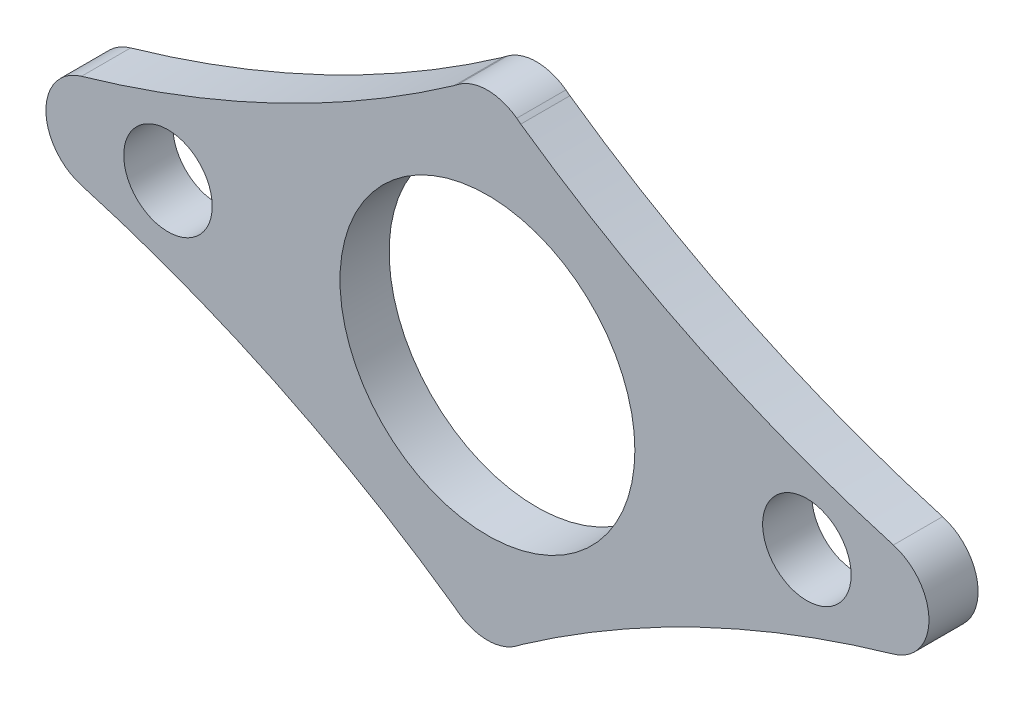
ISO-10303-21;
HEADER;
FILE_DESCRIPTION(('STEP AP214'),'2;1');
FILE_NAME('part.step','',(''),(''),'','','');
FILE_SCHEMA(('AUTOMOTIVE_DESIGN { 1 0 10303 214 1 1 1 1 }'));
ENDSEC;
DATA;
#1=APPLICATION_CONTEXT('core data for automotive mechanical design processes');
#2=APPLICATION_PROTOCOL_DEFINITION('international standard','automotive_design',2000,#1);
#3=PRODUCT_CONTEXT('',#1,'mechanical');
#4=PRODUCT('Part','Part','',(#3));
#5=PRODUCT_RELATED_PRODUCT_CATEGORY('part','',(#4));
#6=PRODUCT_DEFINITION_FORMATION('','',#4);
#7=PRODUCT_DEFINITION_CONTEXT('part definition',#1,'design');
#8=PRODUCT_DEFINITION('design','',#6,#7);
#9=PRODUCT_DEFINITION_SHAPE('','',#8);
#10=(LENGTH_UNIT() NAMED_UNIT(*) SI_UNIT(.MILLI.,.METRE.));
#11=(NAMED_UNIT(*) PLANE_ANGLE_UNIT() SI_UNIT($,.RADIAN.));
#12=(NAMED_UNIT(*) SI_UNIT($,.STERADIAN.) SOLID_ANGLE_UNIT());
#13=UNCERTAINTY_MEASURE_WITH_UNIT(LENGTH_MEASURE(1.E-05),#10,'distance_accuracy_value','');
#14=(GEOMETRIC_REPRESENTATION_CONTEXT(3) GLOBAL_UNCERTAINTY_ASSIGNED_CONTEXT((#13)) GLOBAL_UNIT_ASSIGNED_CONTEXT((#10,
#11,#12)) REPRESENTATION_CONTEXT('',''));
#15=CARTESIAN_POINT('',(0.,0.,0.));
#16=DIRECTION('',(0.,0.,1.));
#17=DIRECTION('',(1.,0.,0.));
#18=AXIS2_PLACEMENT_3D('',#15,#16,#17);
#19=CARTESIAN_POINT('',(-206.734819428964,-429.048910261727,10.));
#20=DIRECTION('',(0.,0.,-1.));
#21=DIRECTION('',(-1.,0.,0.));
#22=AXIS2_PLACEMENT_3D('',#19,#20,#21);
#23=PLANE('',#22);
#24=CARTESIAN_POINT('',(13.0163216309589,-20.9768778503982,10.));
#25=DIRECTION('',(0.,0.,1.));
#26=DIRECTION('',(1.,0.,0.));
#27=AXIS2_PLACEMENT_3D('',#24,#25,#26);
#28=CIRCLE('',#27,31.8082732651629);
#29=CARTESIAN_POINT('',(-6.78490273510037,-45.8702055049376,10.));
#30=VERTEX_POINT('',#29);
#31=CARTESIAN_POINT('',(-5.96852463865239,-46.4982778948805,10.));
#32=VERTEX_POINT('',#31);
#33=EDGE_CURVE('E135',#30,#32,#28,.T.);
#34=ORIENTED_EDGE('',*,*,#33,.T.);
#35=CARTESIAN_POINT('',(0.,-38.4747678376924,10.));
#36=DIRECTION('',(0.,0.,-1.));
#37=DIRECTION('',(-1.,0.,0.));
#38=AXIS2_PLACEMENT_3D('',#35,#36,#37);
#39=CIRCLE('',#38,10.);
#40=CARTESIAN_POINT('',(5.96852463865239,-46.4982778948805,10.));
#41=VERTEX_POINT('',#40);
#42=EDGE_CURVE('E214',#32,#41,#39,.F.);
#43=ORIENTED_EDGE('',*,*,#42,.T.);
#44=CARTESIAN_POINT('',(-13.0163216309589,-20.9768778503982,10.));
#45=DIRECTION('',(0.,0.,1.));
#46=DIRECTION('',(-1.,0.,0.));
#47=AXIS2_PLACEMENT_3D('',#44,#45,#46);
#48=CIRCLE('',#47,31.8082732651629);
#49=CARTESIAN_POINT('',(6.78490273510032,-45.8702055049375,10.));
#50=VERTEX_POINT('',#49);
#51=EDGE_CURVE('E158',#41,#50,#48,.T.);
#52=ORIENTED_EDGE('',*,*,#51,.T.);
#53=CARTESIAN_POINT('',(152.782580989368,-253.747413709875,10.));
#54=DIRECTION('',(0.,0.,-1.));
#55=DIRECTION('',(-1.,0.,0.));
#56=AXIS2_PLACEMENT_3D('',#53,#54,#55);
#57=CIRCLE('',#56,254.024124340023);
#58=CARTESIAN_POINT('',(82.6002961724135,-9.61076622616069,10.));
#59=VERTEX_POINT('',#58);
#60=EDGE_CURVE('E160',#50,#59,#57,.T.);
#61=ORIENTED_EDGE('',*,*,#60,.T.);
#62=CARTESIAN_POINT('',(79.8374764993098,0.,10.));
#63=DIRECTION('',(0.,0.,-1.));
#64=DIRECTION('',(-1.,0.,0.));
#65=AXIS2_PLACEMENT_3D('',#62,#63,#64);
#66=CIRCLE('',#65,10.);
#67=CARTESIAN_POINT('',(82.6002961724135,9.61076622616069,10.));
#68=VERTEX_POINT('',#67);
#69=EDGE_CURVE('E212',#59,#68,#66,.F.);
#70=ORIENTED_EDGE('',*,*,#69,.T.);
#71=CARTESIAN_POINT('',(152.782580989368,253.747413709875,10.));
#72=DIRECTION('',(0.,0.,-1.));
#73=DIRECTION('',(1.,0.,0.));
#74=AXIS2_PLACEMENT_3D('',#71,#72,#73);
#75=CIRCLE('',#74,254.024124340023);
#76=CARTESIAN_POINT('',(6.78490273510038,45.8702055049376,10.));
#77=VERTEX_POINT('',#76);
#78=EDGE_CURVE('E166',#68,#77,#75,.T.);
#79=ORIENTED_EDGE('',*,*,#78,.T.);
#80=CARTESIAN_POINT('',(-13.0163216309589,20.9768778503982,10.));
#81=DIRECTION('',(0.,0.,1.));
#82=DIRECTION('',(1.,0.,0.));
#83=AXIS2_PLACEMENT_3D('',#80,#81,#82);
#84=CIRCLE('',#83,31.8082732651629);
#85=CARTESIAN_POINT('',(5.96852463865239,46.4982778948805,10.));
#86=VERTEX_POINT('',#85);
#87=EDGE_CURVE('E168',#77,#86,#84,.T.);
#88=ORIENTED_EDGE('',*,*,#87,.T.);
#89=CARTESIAN_POINT('',(0.,38.4747678376924,10.));
#90=DIRECTION('',(0.,0.,-1.));
#91=DIRECTION('',(-1.,0.,0.));
#92=AXIS2_PLACEMENT_3D('',#89,#90,#91);
#93=CIRCLE('',#92,10.);
#94=CARTESIAN_POINT('',(-5.96852463865239,46.4982778948805,10.));
#95=VERTEX_POINT('',#94);
#96=EDGE_CURVE('E64',#86,#95,#93,.F.);
#97=ORIENTED_EDGE('',*,*,#96,.T.);
#98=CARTESIAN_POINT('',(13.0163216309589,20.9768778503982,10.));
#99=DIRECTION('',(0.,0.,1.));
#100=DIRECTION('',(-1.,0.,0.));
#101=AXIS2_PLACEMENT_3D('',#98,#99,#100);
#102=CIRCLE('',#101,31.8082732651629);
#103=CARTESIAN_POINT('',(-6.78490273510021,45.8702055049376,10.));
#104=VERTEX_POINT('',#103);
#105=EDGE_CURVE('E170',#95,#104,#102,.T.);
#106=ORIENTED_EDGE('',*,*,#105,.T.);
#107=CARTESIAN_POINT('',(-152.782580989368,253.747413709875,10.));
#108=DIRECTION('',(0.,0.,-1.));
#109=DIRECTION('',(-1.,0.,0.));
#110=AXIS2_PLACEMENT_3D('',#107,#108,#109);
#111=CIRCLE('',#110,254.024124340023);
#112=CARTESIAN_POINT('',(-82.6002961724134,9.61076622616072,10.));
#113=VERTEX_POINT('',#112);
#114=EDGE_CURVE('E172',#104,#113,#111,.T.);
#115=ORIENTED_EDGE('',*,*,#114,.T.);
#116=CARTESIAN_POINT('',(-79.8374764993097,0.,10.));
#117=DIRECTION('',(0.,0.,-1.));
#118=DIRECTION('',(-1.,0.,0.));
#119=AXIS2_PLACEMENT_3D('',#116,#117,#118);
#120=CIRCLE('',#119,10.);
#121=CARTESIAN_POINT('',(-82.6002961724134,-9.61076622616072,10.));
#122=VERTEX_POINT('',#121);
#123=EDGE_CURVE('E138',#113,#122,#120,.F.);
#124=ORIENTED_EDGE('',*,*,#123,.T.);
#125=CARTESIAN_POINT('',(-152.782580989368,-253.747413709875,10.));
#126=DIRECTION('',(0.,0.,-1.));
#127=DIRECTION('',(1.,0.,0.));
#128=AXIS2_PLACEMENT_3D('',#125,#126,#127);
#129=CIRCLE('',#128,254.024124340023);
#130=EDGE_CURVE('E131',#122,#30,#129,.T.);
#131=ORIENTED_EDGE('',*,*,#130,.T.);
#132=EDGE_LOOP('',(#34,#43,#52,#61,#70,#79,#88,#97,#106,#115,#124,#131));
#133=FACE_BOUND('',#132,.T.);
#134=CARTESIAN_POINT('',(0.,0.,10.));
#135=DIRECTION('',(0.,0.,1.));
#136=DIRECTION('',(1.,0.,0.));
#137=AXIS2_PLACEMENT_3D('',#134,#135,#136);
#138=CIRCLE('',#137,30.);
#139=CARTESIAN_POINT('',(30.,0.,10.));
#140=VERTEX_POINT('',#139);
#141=EDGE_CURVE('E177',#140,#140,#138,.T.);
#142=ORIENTED_EDGE('',*,*,#141,.F.);
#143=EDGE_LOOP('',(#142));
#144=FACE_BOUND('',#143,.T.);
#145=CARTESIAN_POINT('',(-65.,0.,10.));
#146=DIRECTION('',(0.,0.,1.));
#147=DIRECTION('',(1.,0.,0.));
#148=AXIS2_PLACEMENT_3D('',#145,#146,#147);
#149=CIRCLE('',#148,9.);
#150=CARTESIAN_POINT('',(-56.,0.,10.));
#151=VERTEX_POINT('',#150);
#152=EDGE_CURVE('E445',#151,#151,#149,.T.);
#153=ORIENTED_EDGE('',*,*,#152,.F.);
#154=EDGE_LOOP('',(#153));
#155=FACE_BOUND('',#154,.T.);
#156=CARTESIAN_POINT('',(65.,0.,10.));
#157=DIRECTION('',(0.,0.,1.));
#158=DIRECTION('',(1.,0.,0.));
#159=AXIS2_PLACEMENT_3D('',#156,#157,#158);
#160=CIRCLE('',#159,9.);
#161=CARTESIAN_POINT('',(74.,0.,10.));
#162=VERTEX_POINT('',#161);
#163=EDGE_CURVE('E452',#162,#162,#160,.T.);
#164=ORIENTED_EDGE('',*,*,#163,.F.);
#165=EDGE_LOOP('',(#164));
#166=FACE_BOUND('',#165,.T.);
#167=ADVANCED_FACE('F41',(#133,#144,#155,#166),#23,.F.);
#168=CARTESIAN_POINT('',(-206.734819428964,-429.048910261727,0.));
#169=DIRECTION('',(0.,0.,-1.));
#170=DIRECTION('',(-1.,0.,0.));
#171=AXIS2_PLACEMENT_3D('',#168,#169,#170);
#172=PLANE('',#171);
#173=CARTESIAN_POINT('',(-65.,0.,0.));
#174=DIRECTION('',(0.,0.,1.));
#175=DIRECTION('',(1.,0.,0.));
#176=AXIS2_PLACEMENT_3D('',#173,#174,#175);
#177=CIRCLE('',#176,9.);
#178=CARTESIAN_POINT('',(-56.,0.,0.));
#179=VERTEX_POINT('',#178);
#180=EDGE_CURVE('E448',#179,#179,#177,.T.);
#181=ORIENTED_EDGE('',*,*,#180,.T.);
#182=EDGE_LOOP('',(#181));
#183=FACE_BOUND('',#182,.T.);
#184=CARTESIAN_POINT('',(-13.0163216309589,-20.9768778503982,0.));
#185=DIRECTION('',(0.,0.,1.));
#186=DIRECTION('',(-1.,0.,0.));
#187=AXIS2_PLACEMENT_3D('',#184,#185,#186);
#188=CIRCLE('',#187,31.8082732651629);
#189=CARTESIAN_POINT('',(5.96852463865239,-46.4982778948805,0.));
#190=VERTEX_POINT('',#189);
#191=CARTESIAN_POINT('',(6.78490273510032,-45.8702055049375,0.));
#192=VERTEX_POINT('',#191);
#193=EDGE_CURVE('E179',#190,#192,#188,.T.);
#194=ORIENTED_EDGE('',*,*,#193,.F.);
#195=CARTESIAN_POINT('',(0.,-38.4747678376924,0.));
#196=DIRECTION('',(0.,0.,-1.));
#197=DIRECTION('',(-1.,0.,0.));
#198=AXIS2_PLACEMENT_3D('',#195,#196,#197);
#199=CIRCLE('',#198,10.);
#200=CARTESIAN_POINT('',(-5.96852463865239,-46.4982778948805,0.));
#201=VERTEX_POINT('',#200);
#202=EDGE_CURVE('E207',#190,#201,#199,.T.);
#203=ORIENTED_EDGE('',*,*,#202,.T.);
#204=CARTESIAN_POINT('',(13.0163216309589,-20.9768778503982,0.));
#205=DIRECTION('',(0.,0.,1.));
#206=DIRECTION('',(1.,0.,0.));
#207=AXIS2_PLACEMENT_3D('',#204,#205,#206);
#208=CIRCLE('',#207,31.8082732651629);
#209=CARTESIAN_POINT('',(-6.78490273510037,-45.8702055049376,0.));
#210=VERTEX_POINT('',#209);
#211=EDGE_CURVE('E176',#210,#201,#208,.T.);
#212=ORIENTED_EDGE('',*,*,#211,.F.);
#213=CARTESIAN_POINT('',(-152.782580989368,-253.747413709875,0.));
#214=DIRECTION('',(0.,0.,-1.));
#215=DIRECTION('',(1.,0.,0.));
#216=AXIS2_PLACEMENT_3D('',#213,#214,#215);
#217=CIRCLE('',#216,254.024124340023);
#218=CARTESIAN_POINT('',(-82.6002961724134,-9.61076622616072,0.));
#219=VERTEX_POINT('',#218);
#220=EDGE_CURVE('E148',#219,#210,#217,.T.);
#221=ORIENTED_EDGE('',*,*,#220,.F.);
#222=CARTESIAN_POINT('',(-79.8374764993097,0.,0.));
#223=DIRECTION('',(0.,0.,-1.));
#224=DIRECTION('',(-1.,0.,0.));
#225=AXIS2_PLACEMENT_3D('',#222,#223,#224);
#226=CIRCLE('',#225,10.);
#227=CARTESIAN_POINT('',(-82.6002961724134,9.61076622616072,0.));
#228=VERTEX_POINT('',#227);
#229=EDGE_CURVE('E203',#219,#228,#226,.T.);
#230=ORIENTED_EDGE('',*,*,#229,.T.);
#231=CARTESIAN_POINT('',(-152.782580989368,253.747413709875,0.));
#232=DIRECTION('',(0.,0.,-1.));
#233=DIRECTION('',(-1.,0.,0.));
#234=AXIS2_PLACEMENT_3D('',#231,#232,#233);
#235=CIRCLE('',#234,254.024124340023);
#236=CARTESIAN_POINT('',(-6.78490273510021,45.8702055049376,0.));
#237=VERTEX_POINT('',#236);
#238=EDGE_CURVE('E142',#237,#228,#235,.T.);
#239=ORIENTED_EDGE('',*,*,#238,.F.);
#240=CARTESIAN_POINT('',(13.0163216309589,20.9768778503982,0.));
#241=DIRECTION('',(0.,0.,1.));
#242=DIRECTION('',(-1.,0.,0.));
#243=AXIS2_PLACEMENT_3D('',#240,#241,#242);
#244=CIRCLE('',#243,31.8082732651629);
#245=CARTESIAN_POINT('',(-5.96852463865239,46.4982778948805,0.));
#246=VERTEX_POINT('',#245);
#247=EDGE_CURVE('E189',#246,#237,#244,.T.);
#248=ORIENTED_EDGE('',*,*,#247,.F.);
#249=CARTESIAN_POINT('',(0.,38.4747678376924,0.));
#250=DIRECTION('',(0.,0.,-1.));
#251=DIRECTION('',(-1.,0.,0.));
#252=AXIS2_PLACEMENT_3D('',#249,#250,#251);
#253=CIRCLE('',#252,10.);
#254=CARTESIAN_POINT('',(5.96852463865239,46.4982778948805,0.));
#255=VERTEX_POINT('',#254);
#256=EDGE_CURVE('E201',#246,#255,#253,.T.);
#257=ORIENTED_EDGE('',*,*,#256,.T.);
#258=CARTESIAN_POINT('',(-13.0163216309589,20.9768778503982,0.));
#259=DIRECTION('',(0.,0.,1.));
#260=DIRECTION('',(1.,0.,0.));
#261=AXIS2_PLACEMENT_3D('',#258,#259,#260);
#262=CIRCLE('',#261,31.8082732651629);
#263=CARTESIAN_POINT('',(6.78490273510038,45.8702055049376,0.));
#264=VERTEX_POINT('',#263);
#265=EDGE_CURVE('E186',#264,#255,#262,.T.);
#266=ORIENTED_EDGE('',*,*,#265,.F.);
#267=CARTESIAN_POINT('',(152.782580989368,253.747413709875,0.));
#268=DIRECTION('',(0.,0.,-1.));
#269=DIRECTION('',(1.,0.,0.));
#270=AXIS2_PLACEMENT_3D('',#267,#268,#269);
#271=CIRCLE('',#270,254.024124340023);
#272=CARTESIAN_POINT('',(82.6002961724135,9.61076622616069,0.));
#273=VERTEX_POINT('',#272);
#274=EDGE_CURVE('E184',#273,#264,#271,.T.);
#275=ORIENTED_EDGE('',*,*,#274,.F.);
#276=CARTESIAN_POINT('',(79.8374764993098,0.,0.));
#277=DIRECTION('',(0.,0.,-1.));
#278=DIRECTION('',(-1.,0.,0.));
#279=AXIS2_PLACEMENT_3D('',#276,#277,#278);
#280=CIRCLE('',#279,10.);
#281=CARTESIAN_POINT('',(82.6002961724135,-9.61076622616072,0.));
#282=VERTEX_POINT('',#281);
#283=EDGE_CURVE('E205',#273,#282,#280,.T.);
#284=ORIENTED_EDGE('',*,*,#283,.T.);
#285=CARTESIAN_POINT('',(152.782580989368,-253.747413709875,0.));
#286=DIRECTION('',(0.,0.,-1.));
#287=DIRECTION('',(-1.,0.,0.));
#288=AXIS2_PLACEMENT_3D('',#285,#286,#287);
#289=CIRCLE('',#288,254.024124340023);
#290=EDGE_CURVE('E181',#192,#282,#289,.T.);
#291=ORIENTED_EDGE('',*,*,#290,.F.);
#292=EDGE_LOOP('',(#194,#203,#212,#221,#230,#239,#248,#257,#266,#275,#284,#291));
#293=FACE_BOUND('',#292,.T.);
#294=CARTESIAN_POINT('',(0.,0.,0.));
#295=DIRECTION('',(0.,0.,1.));
#296=DIRECTION('',(1.,0.,0.));
#297=AXIS2_PLACEMENT_3D('',#294,#295,#296);
#298=CIRCLE('',#297,30.);
#299=CARTESIAN_POINT('',(30.,0.,0.));
#300=VERTEX_POINT('',#299);
#301=EDGE_CURVE('E444',#300,#300,#298,.T.);
#302=ORIENTED_EDGE('',*,*,#301,.T.);
#303=EDGE_LOOP('',(#302));
#304=FACE_BOUND('',#303,.T.);
#305=CARTESIAN_POINT('',(65.,0.,0.));
#306=DIRECTION('',(0.,0.,1.));
#307=DIRECTION('',(1.,0.,0.));
#308=AXIS2_PLACEMENT_3D('',#305,#306,#307);
#309=CIRCLE('',#308,9.);
#310=CARTESIAN_POINT('',(74.,0.,0.));
#311=VERTEX_POINT('',#310);
#312=EDGE_CURVE('E454',#311,#311,#309,.T.);
#313=ORIENTED_EDGE('',*,*,#312,.T.);
#314=EDGE_LOOP('',(#313));
#315=FACE_BOUND('',#314,.T.);
#316=ADVANCED_FACE('F233',(#183,#293,#304,#315),#172,.T.);
#317=CARTESIAN_POINT('',(-152.782580989368,-253.747413709875,10.));
#318=DIRECTION('',(0.,0.,-1.));
#319=DIRECTION('',(-1.,0.,0.));
#320=AXIS2_PLACEMENT_3D('',#317,#318,#319);
#321=CYLINDRICAL_SURFACE('',#320,254.024124340023);
#322=ORIENTED_EDGE('',*,*,#130,.F.);
#323=DIRECTION('',(0.,0.,-1.));
#324=VECTOR('',#323,1.);
#325=CARTESIAN_POINT('',(-82.6002961724134,-9.61076622616067,10.));
#326=LINE('',#325,#324);
#327=EDGE_CURVE('E221',#122,#219,#326,.T.);
#328=ORIENTED_EDGE('',*,*,#327,.T.);
#329=ORIENTED_EDGE('',*,*,#220,.T.);
#330=DIRECTION('',(0.,0.,-1.));
#331=VECTOR('',#330,1.);
#332=CARTESIAN_POINT('',(-6.78490273510037,-45.8702055049376,10.));
#333=LINE('',#332,#331);
#334=EDGE_CURVE('E145',#30,#210,#333,.T.);
#335=ORIENTED_EDGE('',*,*,#334,.F.);
#336=EDGE_LOOP('',(#322,#328,#329,#335));
#337=FACE_BOUND('',#336,.T.);
#338=ADVANCED_FACE('F146',(#337),#321,.F.);
#339=CARTESIAN_POINT('',(13.0163216309589,-20.9768778503982,10.));
#340=DIRECTION('',(0.,0.,-1.));
#341=DIRECTION('',(-1.,0.,0.));
#342=AXIS2_PLACEMENT_3D('',#339,#340,#341);
#343=CYLINDRICAL_SURFACE('',#342,31.8082732651629);
#344=ORIENTED_EDGE('',*,*,#211,.T.);
#345=DIRECTION('',(0.,0.,-1.));
#346=VECTOR('',#345,1.);
#347=CARTESIAN_POINT('',(-5.96852463865239,-46.4982778948805,10.));
#348=LINE('',#347,#346);
#349=EDGE_CURVE('E157',#201,#32,#348,.F.);
#350=ORIENTED_EDGE('',*,*,#349,.T.);
#351=ORIENTED_EDGE('',*,*,#33,.F.);
#352=ORIENTED_EDGE('',*,*,#334,.T.);
#353=EDGE_LOOP('',(#344,#350,#351,#352));
#354=FACE_BOUND('',#353,.T.);
#355=ADVANCED_FACE('F155',(#354),#343,.T.);
#356=CARTESIAN_POINT('',(-13.0163216309589,-20.9768778503982,10.));
#357=DIRECTION('',(0.,0.,-1.));
#358=DIRECTION('',(-1.,0.,0.));
#359=AXIS2_PLACEMENT_3D('',#356,#357,#358);
#360=CYLINDRICAL_SURFACE('',#359,31.8082732651629);
#361=ORIENTED_EDGE('',*,*,#51,.F.);
#362=DIRECTION('',(0.,0.,-1.));
#363=VECTOR('',#362,1.);
#364=CARTESIAN_POINT('',(5.96852463865239,-46.4982778948805,10.));
#365=LINE('',#364,#363);
#366=EDGE_CURVE('E152',#41,#190,#365,.T.);
#367=ORIENTED_EDGE('',*,*,#366,.T.);
#368=ORIENTED_EDGE('',*,*,#193,.T.);
#369=DIRECTION('',(0.,0.,-1.));
#370=VECTOR('',#369,1.);
#371=CARTESIAN_POINT('',(6.78490273510032,-45.8702055049375,10.));
#372=LINE('',#371,#370);
#373=EDGE_CURVE('E153',#50,#192,#372,.T.);
#374=ORIENTED_EDGE('',*,*,#373,.F.);
#375=EDGE_LOOP('',(#361,#367,#368,#374));
#376=FACE_BOUND('',#375,.T.);
#377=ADVANCED_FACE('F245',(#376),#360,.T.);
#378=CARTESIAN_POINT('',(152.782580989368,-253.747413709875,10.));
#379=DIRECTION('',(0.,0.,-1.));
#380=DIRECTION('',(-1.,0.,0.));
#381=AXIS2_PLACEMENT_3D('',#378,#379,#380);
#382=CYLINDRICAL_SURFACE('',#381,254.024124340023);
#383=ORIENTED_EDGE('',*,*,#290,.T.);
#384=DIRECTION('',(0.,0.,-1.));
#385=VECTOR('',#384,1.);
#386=CARTESIAN_POINT('',(82.6002961724135,-9.61076622616069,10.));
#387=LINE('',#386,#385);
#388=EDGE_CURVE('E219',#282,#59,#387,.F.);
#389=ORIENTED_EDGE('',*,*,#388,.T.);
#390=ORIENTED_EDGE('',*,*,#60,.F.);
#391=ORIENTED_EDGE('',*,*,#373,.T.);
#392=EDGE_LOOP('',(#383,#389,#390,#391));
#393=FACE_BOUND('',#392,.T.);
#394=ADVANCED_FACE('F249',(#393),#382,.F.);
#395=CARTESIAN_POINT('',(152.782580989368,253.747413709875,10.));
#396=DIRECTION('',(0.,0.,-1.));
#397=DIRECTION('',(-1.,0.,0.));
#398=AXIS2_PLACEMENT_3D('',#395,#396,#397);
#399=CYLINDRICAL_SURFACE('',#398,254.024124340023);
#400=ORIENTED_EDGE('',*,*,#78,.F.);
#401=DIRECTION('',(0.,0.,-1.));
#402=VECTOR('',#401,1.);
#403=CARTESIAN_POINT('',(82.6002961724135,9.61076622616069,10.));
#404=LINE('',#403,#402);
#405=EDGE_CURVE('E216',#68,#273,#404,.T.);
#406=ORIENTED_EDGE('',*,*,#405,.T.);
#407=ORIENTED_EDGE('',*,*,#274,.T.);
#408=DIRECTION('',(0.,0.,-1.));
#409=VECTOR('',#408,1.);
#410=CARTESIAN_POINT('',(6.78490273510038,45.8702055049376,10.));
#411=LINE('',#410,#409);
#412=EDGE_CURVE('E194',#77,#264,#411,.T.);
#413=ORIENTED_EDGE('',*,*,#412,.F.);
#414=EDGE_LOOP('',(#400,#406,#407,#413));
#415=FACE_BOUND('',#414,.T.);
#416=ADVANCED_FACE('F258',(#415),#399,.F.);
#417=CARTESIAN_POINT('',(-13.0163216309589,20.9768778503982,10.));
#418=DIRECTION('',(0.,0.,-1.));
#419=DIRECTION('',(-1.,0.,0.));
#420=AXIS2_PLACEMENT_3D('',#417,#418,#419);
#421=CYLINDRICAL_SURFACE('',#420,31.8082732651629);
#422=ORIENTED_EDGE('',*,*,#265,.T.);
#423=DIRECTION('',(0.,0.,-1.));
#424=VECTOR('',#423,1.);
#425=CARTESIAN_POINT('',(5.96852463865239,46.4982778948805,10.));
#426=LINE('',#425,#424);
#427=EDGE_CURVE('E11',#255,#86,#426,.F.);
#428=ORIENTED_EDGE('',*,*,#427,.T.);
#429=ORIENTED_EDGE('',*,*,#87,.F.);
#430=ORIENTED_EDGE('',*,*,#412,.T.);
#431=EDGE_LOOP('',(#422,#428,#429,#430));
#432=FACE_BOUND('',#431,.T.);
#433=ADVANCED_FACE('F262',(#432),#421,.T.);
#434=CARTESIAN_POINT('',(13.0163216309589,20.9768778503982,10.));
#435=DIRECTION('',(0.,0.,-1.));
#436=DIRECTION('',(-1.,0.,0.));
#437=AXIS2_PLACEMENT_3D('',#434,#435,#436);
#438=CYLINDRICAL_SURFACE('',#437,31.8082732651629);
#439=ORIENTED_EDGE('',*,*,#105,.F.);
#440=DIRECTION('',(0.,0.,-1.));
#441=VECTOR('',#440,1.);
#442=CARTESIAN_POINT('',(-5.96852463865239,46.4982778948805,10.));
#443=LINE('',#442,#441);
#444=EDGE_CURVE('E49',#95,#246,#443,.T.);
#445=ORIENTED_EDGE('',*,*,#444,.T.);
#446=ORIENTED_EDGE('',*,*,#247,.T.);
#447=DIRECTION('',(0.,0.,-1.));
#448=VECTOR('',#447,1.);
#449=CARTESIAN_POINT('',(-6.78490273510021,45.8702055049376,10.));
#450=LINE('',#449,#448);
#451=EDGE_CURVE('E174',#104,#237,#450,.T.);
#452=ORIENTED_EDGE('',*,*,#451,.F.);
#453=EDGE_LOOP('',(#439,#445,#446,#452));
#454=FACE_BOUND('',#453,.T.);
#455=ADVANCED_FACE('F227',(#454),#438,.T.);
#456=CARTESIAN_POINT('',(-152.782580989368,253.747413709875,10.));
#457=DIRECTION('',(0.,0.,-1.));
#458=DIRECTION('',(-1.,0.,0.));
#459=AXIS2_PLACEMENT_3D('',#456,#457,#458);
#460=CYLINDRICAL_SURFACE('',#459,254.024124340023);
#461=ORIENTED_EDGE('',*,*,#238,.T.);
#462=DIRECTION('',(0.,0.,-1.));
#463=VECTOR('',#462,1.);
#464=CARTESIAN_POINT('',(-82.6002961724134,9.61076622616067,10.));
#465=LINE('',#464,#463);
#466=EDGE_CURVE('E56',#228,#113,#465,.F.);
#467=ORIENTED_EDGE('',*,*,#466,.T.);
#468=ORIENTED_EDGE('',*,*,#114,.F.);
#469=ORIENTED_EDGE('',*,*,#451,.T.);
#470=EDGE_LOOP('',(#461,#467,#468,#469));
#471=FACE_BOUND('',#470,.T.);
#472=ADVANCED_FACE('F236',(#471),#460,.F.);
#473=CARTESIAN_POINT('',(0.,0.,10.));
#474=DIRECTION('',(0.,0.,-1.));
#475=DIRECTION('',(-1.,0.,0.));
#476=AXIS2_PLACEMENT_3D('',#473,#474,#475);
#477=CYLINDRICAL_SURFACE('',#476,30.);
#478=ORIENTED_EDGE('',*,*,#141,.T.);
#479=EDGE_LOOP('',(#478));
#480=FACE_BOUND('',#479,.T.);
#481=ORIENTED_EDGE('',*,*,#301,.F.);
#482=EDGE_LOOP('',(#481));
#483=FACE_BOUND('',#482,.T.);
#484=ADVANCED_FACE('F276',(#480,#483),#477,.F.);
#485=CARTESIAN_POINT('',(-65.,0.,10.));
#486=DIRECTION('',(0.,0.,-1.));
#487=DIRECTION('',(-1.,0.,0.));
#488=AXIS2_PLACEMENT_3D('',#485,#486,#487);
#489=CYLINDRICAL_SURFACE('',#488,9.);
#490=ORIENTED_EDGE('',*,*,#152,.T.);
#491=EDGE_LOOP('',(#490));
#492=FACE_BOUND('',#491,.T.);
#493=ORIENTED_EDGE('',*,*,#180,.F.);
#494=EDGE_LOOP('',(#493));
#495=FACE_BOUND('',#494,.T.);
#496=ADVANCED_FACE('F333',(#492,#495),#489,.F.);
#497=CARTESIAN_POINT('',(65.,0.,10.));
#498=DIRECTION('',(0.,0.,-1.));
#499=DIRECTION('',(-1.,0.,0.));
#500=AXIS2_PLACEMENT_3D('',#497,#498,#499);
#501=CYLINDRICAL_SURFACE('',#500,9.);
#502=ORIENTED_EDGE('',*,*,#163,.T.);
#503=EDGE_LOOP('',(#502));
#504=FACE_BOUND('',#503,.T.);
#505=ORIENTED_EDGE('',*,*,#312,.F.);
#506=EDGE_LOOP('',(#505));
#507=FACE_BOUND('',#506,.T.);
#508=ADVANCED_FACE('F297',(#504,#507),#501,.F.);
#509=CARTESIAN_POINT('',(0.,-38.4747678376924,10.));
#510=DIRECTION('',(0.,0.,-1.));
#511=DIRECTION('',(-1.,0.,0.));
#512=AXIS2_PLACEMENT_3D('',#509,#510,#511);
#513=CYLINDRICAL_SURFACE('',#512,10.);
#514=ORIENTED_EDGE('',*,*,#42,.F.);
#515=ORIENTED_EDGE('',*,*,#349,.F.);
#516=ORIENTED_EDGE('',*,*,#202,.F.);
#517=ORIENTED_EDGE('',*,*,#366,.F.);
#518=EDGE_LOOP('',(#514,#515,#516,#517));
#519=FACE_BOUND('',#518,.T.);
#520=ADVANCED_FACE('F240',(#519),#513,.T.);
#521=CARTESIAN_POINT('',(79.8374764993098,0.,10.));
#522=DIRECTION('',(0.,0.,-1.));
#523=DIRECTION('',(-1.,0.,0.));
#524=AXIS2_PLACEMENT_3D('',#521,#522,#523);
#525=CYLINDRICAL_SURFACE('',#524,10.);
#526=ORIENTED_EDGE('',*,*,#69,.F.);
#527=ORIENTED_EDGE('',*,*,#388,.F.);
#528=ORIENTED_EDGE('',*,*,#283,.F.);
#529=ORIENTED_EDGE('',*,*,#405,.F.);
#530=EDGE_LOOP('',(#526,#527,#528,#529));
#531=FACE_BOUND('',#530,.T.);
#532=ADVANCED_FACE('F255',(#531),#525,.T.);
#533=CARTESIAN_POINT('',(-79.8374764993097,0.,10.));
#534=DIRECTION('',(0.,0.,-1.));
#535=DIRECTION('',(-1.,0.,0.));
#536=AXIS2_PLACEMENT_3D('',#533,#534,#535);
#537=CYLINDRICAL_SURFACE('',#536,10.);
#538=ORIENTED_EDGE('',*,*,#123,.F.);
#539=ORIENTED_EDGE('',*,*,#466,.F.);
#540=ORIENTED_EDGE('',*,*,#229,.F.);
#541=ORIENTED_EDGE('',*,*,#327,.F.);
#542=EDGE_LOOP('',(#538,#539,#540,#541));
#543=FACE_BOUND('',#542,.T.);
#544=ADVANCED_FACE('F238',(#543),#537,.T.);
#545=CARTESIAN_POINT('',(0.,38.4747678376924,10.));
#546=DIRECTION('',(0.,0.,-1.));
#547=DIRECTION('',(-1.,0.,0.));
#548=AXIS2_PLACEMENT_3D('',#545,#546,#547);
#549=CYLINDRICAL_SURFACE('',#548,10.);
#550=ORIENTED_EDGE('',*,*,#96,.F.);
#551=ORIENTED_EDGE('',*,*,#427,.F.);
#552=ORIENTED_EDGE('',*,*,#256,.F.);
#553=ORIENTED_EDGE('',*,*,#444,.F.);
#554=EDGE_LOOP('',(#550,#551,#552,#553));
#555=FACE_BOUND('',#554,.T.);
#556=ADVANCED_FACE('F43',(#555),#549,.T.);
#557=CLOSED_SHELL('',(#167,#316,#338,#355,#377,#394,#416,#433,#455,#472,#484,#496,#508,#520,
#532,#544,#556));
#558=MANIFOLD_SOLID_BREP('B2',#557);
#559=ADVANCED_BREP_SHAPE_REPRESENTATION('',(#18,#558),#14);
#560=SHAPE_DEFINITION_REPRESENTATION(#9,#559);
ENDSEC;
END-ISO-10303-21;
